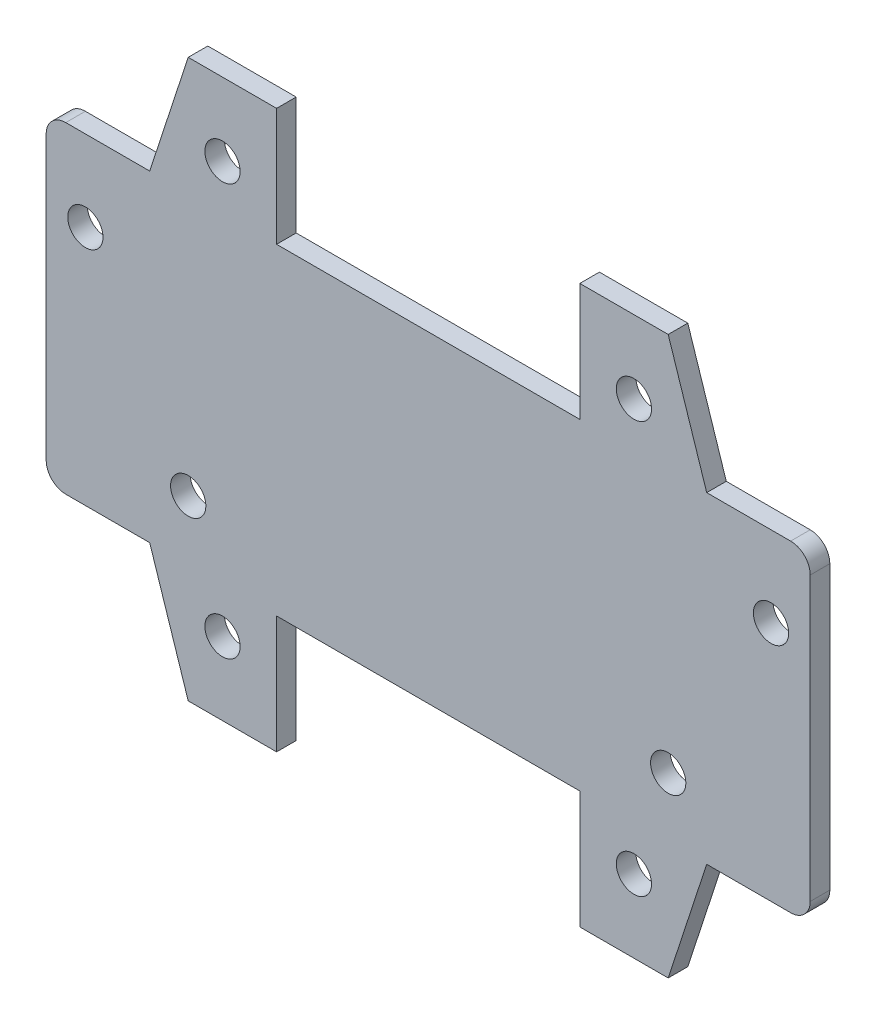
ISO-10303-21;
HEADER;
FILE_DESCRIPTION(('STEP AP214'),'2;1');
FILE_NAME('part.step','',(''),(''),'','','');
FILE_SCHEMA(('AUTOMOTIVE_DESIGN { 1 0 10303 214 1 1 1 1 }'));
ENDSEC;
DATA;
#1=APPLICATION_CONTEXT('core data for automotive mechanical design processes');
#2=APPLICATION_PROTOCOL_DEFINITION('international standard','automotive_design',2000,#1);
#3=PRODUCT_CONTEXT('',#1,'mechanical');
#4=PRODUCT('Part','Part','',(#3));
#5=PRODUCT_RELATED_PRODUCT_CATEGORY('part','',(#4));
#6=PRODUCT_DEFINITION_FORMATION('','',#4);
#7=PRODUCT_DEFINITION_CONTEXT('part definition',#1,'design');
#8=PRODUCT_DEFINITION('design','',#6,#7);
#9=PRODUCT_DEFINITION_SHAPE('','',#8);
#10=(LENGTH_UNIT() NAMED_UNIT(*) SI_UNIT(.MILLI.,.METRE.));
#11=(NAMED_UNIT(*) PLANE_ANGLE_UNIT() SI_UNIT($,.RADIAN.));
#12=(NAMED_UNIT(*) SI_UNIT($,.STERADIAN.) SOLID_ANGLE_UNIT());
#13=UNCERTAINTY_MEASURE_WITH_UNIT(LENGTH_MEASURE(1.E-05),#10,'distance_accuracy_value','');
#14=(GEOMETRIC_REPRESENTATION_CONTEXT(3) GLOBAL_UNCERTAINTY_ASSIGNED_CONTEXT((#13)) GLOBAL_UNIT_ASSIGNED_CONTEXT((#10,
#11,#12)) REPRESENTATION_CONTEXT('',''));
#15=CARTESIAN_POINT('',(0.,0.,0.));
#16=DIRECTION('',(0.,0.,1.));
#17=DIRECTION('',(1.,0.,0.));
#18=AXIS2_PLACEMENT_3D('',#15,#16,#17);
#19=CARTESIAN_POINT('',(0.,-16.4285714285714,2.));
#20=DIRECTION('',(0.,-1.,0.));
#21=DIRECTION('',(0.,0.,-1.));
#22=AXIS2_PLACEMENT_3D('',#19,#20,#21);
#23=PLANE('',#22);
#24=DIRECTION('',(-1.,0.,0.));
#25=VECTOR('',#24,1.);
#26=CARTESIAN_POINT('',(0.,-16.4285714285714,0.));
#27=LINE('',#26,#25);
#28=CARTESIAN_POINT('',(15.4784578863313,-16.4285714285714,0.));
#29=VERTEX_POINT('',#28);
#30=CARTESIAN_POINT('',(-15.4784578863313,-16.4285714285714,0.));
#31=VERTEX_POINT('',#30);
#32=EDGE_CURVE('E203',#29,#31,#27,.T.);
#33=ORIENTED_EDGE('',*,*,#32,.F.);
#34=DIRECTION('',(0.,0.,-1.));
#35=VECTOR('',#34,1.);
#36=CARTESIAN_POINT('',(15.4784578863313,-16.4285714285714,2.));
#37=LINE('',#36,#35);
#38=CARTESIAN_POINT('',(15.4784578863313,-16.4285714285714,2.));
#39=VERTEX_POINT('',#38);
#40=EDGE_CURVE('E199',#39,#29,#37,.T.);
#41=ORIENTED_EDGE('',*,*,#40,.F.);
#42=DIRECTION('',(-1.,0.,0.));
#43=VECTOR('',#42,1.);
#44=CARTESIAN_POINT('',(0.,-16.4285714285714,2.));
#45=LINE('',#44,#43);
#46=CARTESIAN_POINT('',(-15.4784578863313,-16.4285714285714,2.));
#47=VERTEX_POINT('',#46);
#48=EDGE_CURVE('E201',#39,#47,#45,.T.);
#49=ORIENTED_EDGE('',*,*,#48,.T.);
#50=DIRECTION('',(0.,0.,-1.));
#51=VECTOR('',#50,1.);
#52=CARTESIAN_POINT('',(-15.4784578863313,-16.4285714285714,2.));
#53=LINE('',#52,#51);
#54=EDGE_CURVE('E288',#47,#31,#53,.T.);
#55=ORIENTED_EDGE('',*,*,#54,.T.);
#56=EDGE_LOOP('',(#33,#41,#49,#55));
#57=FACE_BOUND('',#56,.T.);
#58=ADVANCED_FACE('F37',(#57),#23,.T.);
#59=CARTESIAN_POINT('',(15.4784578863313,0.,2.));
#60=DIRECTION('',(-1.,0.,0.));
#61=DIRECTION('',(0.,0.,1.));
#62=AXIS2_PLACEMENT_3D('',#59,#60,#61);
#63=PLANE('',#62);
#64=DIRECTION('',(0.,1.,0.));
#65=VECTOR('',#64,1.);
#66=CARTESIAN_POINT('',(15.4784578863313,0.,0.));
#67=LINE('',#66,#65);
#68=CARTESIAN_POINT('',(15.4784578863313,-28.4490152823369,0.));
#69=VERTEX_POINT('',#68);
#70=EDGE_CURVE('E296',#69,#29,#67,.T.);
#71=ORIENTED_EDGE('',*,*,#70,.F.);
#72=DIRECTION('',(0.,0.,-1.));
#73=VECTOR('',#72,1.);
#74=CARTESIAN_POINT('',(15.4784578863313,-28.4490152823369,2.));
#75=LINE('',#74,#73);
#76=CARTESIAN_POINT('',(15.4784578863313,-28.4490152823369,2.));
#77=VERTEX_POINT('',#76);
#78=EDGE_CURVE('E209',#77,#69,#75,.T.);
#79=ORIENTED_EDGE('',*,*,#78,.F.);
#80=DIRECTION('',(0.,1.,0.));
#81=VECTOR('',#80,1.);
#82=CARTESIAN_POINT('',(15.4784578863313,0.,2.));
#83=LINE('',#82,#81);
#84=EDGE_CURVE('E216',#77,#39,#83,.T.);
#85=ORIENTED_EDGE('',*,*,#84,.T.);
#86=ORIENTED_EDGE('',*,*,#40,.T.);
#87=EDGE_LOOP('',(#71,#79,#85,#86));
#88=FACE_BOUND('',#87,.T.);
#89=ADVANCED_FACE('F223',(#88),#63,.T.);
#90=CARTESIAN_POINT('',(0.,-28.4490152823369,2.));
#91=DIRECTION('',(0.,-1.,0.));
#92=DIRECTION('',(1.,0.,0.));
#93=AXIS2_PLACEMENT_3D('',#90,#91,#92);
#94=PLANE('',#93);
#95=DIRECTION('',(-1.,0.,0.));
#96=VECTOR('',#95,1.);
#97=CARTESIAN_POINT('',(0.,-28.4490152823369,0.));
#98=LINE('',#97,#96);
#99=CARTESIAN_POINT('',(24.5,-28.4490152823369,0.));
#100=VERTEX_POINT('',#99);
#101=EDGE_CURVE('E298',#100,#69,#98,.T.);
#102=ORIENTED_EDGE('',*,*,#101,.F.);
#103=DIRECTION('',(0.,0.,-1.));
#104=VECTOR('',#103,1.);
#105=CARTESIAN_POINT('',(24.5,-28.4490152823369,2.));
#106=LINE('',#105,#104);
#107=CARTESIAN_POINT('',(24.5,-28.4490152823369,2.));
#108=VERTEX_POINT('',#107);
#109=EDGE_CURVE('E401',#108,#100,#106,.T.);
#110=ORIENTED_EDGE('',*,*,#109,.F.);
#111=DIRECTION('',(-1.,0.,0.));
#112=VECTOR('',#111,1.);
#113=CARTESIAN_POINT('',(0.,-28.4490152823369,2.));
#114=LINE('',#113,#112);
#115=EDGE_CURVE('E224',#108,#77,#114,.T.);
#116=ORIENTED_EDGE('',*,*,#115,.T.);
#117=ORIENTED_EDGE('',*,*,#78,.T.);
#118=EDGE_LOOP('',(#102,#110,#116,#117));
#119=FACE_BOUND('',#118,.T.);
#120=ADVANCED_FACE('F460',(#119),#94,.T.);
#121=CARTESIAN_POINT('',(30.5374078821787,-9.98542394483885,2.));
#122=DIRECTION('',(0.950476564326026,-0.310796236571476,0.));
#123=DIRECTION('',(0.310796236571476,0.950476564326027,0.));
#124=AXIS2_PLACEMENT_3D('',#121,#122,#123);
#125=PLANE('',#124);
#126=DIRECTION('',(-0.310796236571476,-0.950476564326027,0.));
#127=VECTOR('',#126,1.);
#128=CARTESIAN_POINT('',(30.5374078821787,-9.98542394483885,0.));
#129=LINE('',#128,#127);
#130=CARTESIAN_POINT('',(28.4305637318035,-16.4285714285714,0.));
#131=VERTEX_POINT('',#130);
#132=EDGE_CURVE('E301',#131,#100,#129,.T.);
#133=ORIENTED_EDGE('',*,*,#132,.F.);
#134=DIRECTION('',(0.,0.,-1.));
#135=VECTOR('',#134,1.);
#136=CARTESIAN_POINT('',(28.4305637318035,-16.4285714285714,2.));
#137=LINE('',#136,#135);
#138=CARTESIAN_POINT('',(28.4305637318035,-16.4285714285714,2.));
#139=VERTEX_POINT('',#138);
#140=EDGE_CURVE('E398',#139,#131,#137,.T.);
#141=ORIENTED_EDGE('',*,*,#140,.F.);
#142=DIRECTION('',(-0.310796236571476,-0.950476564326027,0.));
#143=VECTOR('',#142,1.);
#144=CARTESIAN_POINT('',(30.5374078821787,-9.98542394483885,2.));
#145=LINE('',#144,#143);
#146=EDGE_CURVE('E226',#139,#108,#145,.T.);
#147=ORIENTED_EDGE('',*,*,#146,.T.);
#148=ORIENTED_EDGE('',*,*,#109,.T.);
#149=EDGE_LOOP('',(#133,#141,#147,#148));
#150=FACE_BOUND('',#149,.T.);
#151=ADVANCED_FACE('F465',(#150),#125,.T.);
#152=CARTESIAN_POINT('',(0.,-16.4285714285714,2.));
#153=DIRECTION('',(0.,-1.,0.));
#154=DIRECTION('',(1.,0.,0.));
#155=AXIS2_PLACEMENT_3D('',#152,#153,#154);
#156=PLANE('',#155);
#157=DIRECTION('',(-1.,0.,0.));
#158=VECTOR('',#157,1.);
#159=CARTESIAN_POINT('',(0.,-16.4285714285714,0.));
#160=LINE('',#159,#158);
#161=CARTESIAN_POINT('',(37.,-16.4285714285714,0.));
#162=VERTEX_POINT('',#161);
#163=EDGE_CURVE('E304',#162,#131,#160,.T.);
#164=ORIENTED_EDGE('',*,*,#163,.F.);
#165=DIRECTION('',(0.,0.,-1.));
#166=VECTOR('',#165,1.);
#167=CARTESIAN_POINT('',(37.,-16.4285714285714,2.));
#168=LINE('',#167,#166);
#169=CARTESIAN_POINT('',(37.,-16.4285714285714,2.));
#170=VERTEX_POINT('',#169);
#171=EDGE_CURVE('E425',#162,#170,#168,.F.);
#172=ORIENTED_EDGE('',*,*,#171,.T.);
#173=DIRECTION('',(-1.,0.,0.));
#174=VECTOR('',#173,1.);
#175=CARTESIAN_POINT('',(0.,-16.4285714285714,2.));
#176=LINE('',#175,#174);
#177=EDGE_CURVE('E232',#170,#139,#176,.T.);
#178=ORIENTED_EDGE('',*,*,#177,.T.);
#179=ORIENTED_EDGE('',*,*,#140,.T.);
#180=EDGE_LOOP('',(#164,#172,#178,#179));
#181=FACE_BOUND('',#180,.T.);
#182=ADVANCED_FACE('F468',(#181),#156,.T.);
#183=CARTESIAN_POINT('',(39.,0.,2.));
#184=DIRECTION('',(-1.,0.,0.));
#185=DIRECTION('',(0.,0.,1.));
#186=AXIS2_PLACEMENT_3D('',#183,#184,#185);
#187=PLANE('',#186);
#188=DIRECTION('',(0.,1.,0.));
#189=VECTOR('',#188,1.);
#190=CARTESIAN_POINT('',(39.,0.,0.));
#191=LINE('',#190,#189);
#192=CARTESIAN_POINT('',(39.,-14.4285714285714,0.));
#193=VERTEX_POINT('',#192);
#194=CARTESIAN_POINT('',(39.,14.4285714285714,0.));
#195=VERTEX_POINT('',#194);
#196=EDGE_CURVE('E306',#193,#195,#191,.T.);
#197=ORIENTED_EDGE('',*,*,#196,.T.);
#198=DIRECTION('',(0.,0.,-1.));
#199=VECTOR('',#198,1.);
#200=CARTESIAN_POINT('',(39.,14.4285714285714,2.));
#201=LINE('',#200,#199);
#202=CARTESIAN_POINT('',(39.,14.4285714285714,2.));
#203=VERTEX_POINT('',#202);
#204=EDGE_CURVE('E417',#195,#203,#201,.F.);
#205=ORIENTED_EDGE('',*,*,#204,.T.);
#206=DIRECTION('',(0.,1.,0.));
#207=VECTOR('',#206,1.);
#208=CARTESIAN_POINT('',(39.,0.,2.));
#209=LINE('',#208,#207);
#210=CARTESIAN_POINT('',(39.,-14.4285714285714,2.));
#211=VERTEX_POINT('',#210);
#212=EDGE_CURVE('E234',#211,#203,#209,.T.);
#213=ORIENTED_EDGE('',*,*,#212,.F.);
#214=DIRECTION('',(0.,0.,-1.));
#215=VECTOR('',#214,1.);
#216=CARTESIAN_POINT('',(39.,-14.4285714285714,0.));
#217=LINE('',#216,#215);
#218=EDGE_CURVE('E414',#211,#193,#217,.T.);
#219=ORIENTED_EDGE('',*,*,#218,.T.);
#220=EDGE_LOOP('',(#197,#205,#213,#219));
#221=FACE_BOUND('',#220,.T.);
#222=ADVANCED_FACE('F477',(#221),#187,.F.);
#223=CARTESIAN_POINT('',(0.,16.4285714285714,2.));
#224=DIRECTION('',(0.,-1.,0.));
#225=DIRECTION('',(1.,0.,0.));
#226=AXIS2_PLACEMENT_3D('',#223,#224,#225);
#227=PLANE('',#226);
#228=DIRECTION('',(-1.,0.,0.));
#229=VECTOR('',#228,1.);
#230=CARTESIAN_POINT('',(0.,16.4285714285714,2.));
#231=LINE('',#230,#229);
#232=CARTESIAN_POINT('',(37.,16.4285714285714,2.));
#233=VERTEX_POINT('',#232);
#234=CARTESIAN_POINT('',(28.4305637318035,16.4285714285714,2.));
#235=VERTEX_POINT('',#234);
#236=EDGE_CURVE('E236',#233,#235,#231,.T.);
#237=ORIENTED_EDGE('',*,*,#236,.F.);
#238=DIRECTION('',(0.,0.,-1.));
#239=VECTOR('',#238,1.);
#240=CARTESIAN_POINT('',(37.,16.4285714285714,2.));
#241=LINE('',#240,#239);
#242=CARTESIAN_POINT('',(37.,16.4285714285714,0.));
#243=VERTEX_POINT('',#242);
#244=EDGE_CURVE('E208',#233,#243,#241,.T.);
#245=ORIENTED_EDGE('',*,*,#244,.T.);
#246=DIRECTION('',(-1.,0.,0.));
#247=VECTOR('',#246,1.);
#248=CARTESIAN_POINT('',(0.,16.4285714285714,0.));
#249=LINE('',#248,#247);
#250=CARTESIAN_POINT('',(28.4305637318035,16.4285714285714,0.));
#251=VERTEX_POINT('',#250);
#252=EDGE_CURVE('E309',#243,#251,#249,.T.);
#253=ORIENTED_EDGE('',*,*,#252,.T.);
#254=DIRECTION('',(0.,0.,-1.));
#255=VECTOR('',#254,1.);
#256=CARTESIAN_POINT('',(28.4305637318035,16.4285714285714,2.));
#257=LINE('',#256,#255);
#258=EDGE_CURVE('E395',#235,#251,#257,.T.);
#259=ORIENTED_EDGE('',*,*,#258,.F.);
#260=EDGE_LOOP('',(#237,#245,#253,#259));
#261=FACE_BOUND('',#260,.T.);
#262=ADVANCED_FACE('F486',(#261),#227,.F.);
#263=CARTESIAN_POINT('',(30.5374078821787,9.98542394483887,2.));
#264=DIRECTION('',(-0.950476564326026,-0.310796236571476,0.));
#265=DIRECTION('',(0.310796236571476,-0.950476564326026,0.));
#266=AXIS2_PLACEMENT_3D('',#263,#264,#265);
#267=PLANE('',#266);
#268=DIRECTION('',(-0.310796236571476,0.950476564326026,0.));
#269=VECTOR('',#268,1.);
#270=CARTESIAN_POINT('',(30.5374078821787,9.98542394483887,0.));
#271=LINE('',#270,#269);
#272=CARTESIAN_POINT('',(24.5,28.4490152823369,0.));
#273=VERTEX_POINT('',#272);
#274=EDGE_CURVE('E311',#251,#273,#271,.T.);
#275=ORIENTED_EDGE('',*,*,#274,.T.);
#276=DIRECTION('',(0.,0.,-1.));
#277=VECTOR('',#276,1.);
#278=CARTESIAN_POINT('',(24.5,28.4490152823369,2.));
#279=LINE('',#278,#277);
#280=CARTESIAN_POINT('',(24.5,28.4490152823369,2.));
#281=VERTEX_POINT('',#280);
#282=EDGE_CURVE('E392',#281,#273,#279,.T.);
#283=ORIENTED_EDGE('',*,*,#282,.F.);
#284=DIRECTION('',(-0.310796236571476,0.950476564326026,0.));
#285=VECTOR('',#284,1.);
#286=CARTESIAN_POINT('',(30.5374078821787,9.98542394483887,2.));
#287=LINE('',#286,#285);
#288=EDGE_CURVE('E238',#235,#281,#287,.T.);
#289=ORIENTED_EDGE('',*,*,#288,.F.);
#290=ORIENTED_EDGE('',*,*,#258,.T.);
#291=EDGE_LOOP('',(#275,#283,#289,#290));
#292=FACE_BOUND('',#291,.T.);
#293=ADVANCED_FACE('F491',(#292),#267,.F.);
#294=CARTESIAN_POINT('',(0.,28.4490152823369,2.));
#295=DIRECTION('',(0.,-1.,0.));
#296=DIRECTION('',(0.,0.,-1.));
#297=AXIS2_PLACEMENT_3D('',#294,#295,#296);
#298=PLANE('',#297);
#299=DIRECTION('',(-1.,0.,0.));
#300=VECTOR('',#299,1.);
#301=CARTESIAN_POINT('',(0.,28.4490152823369,0.));
#302=LINE('',#301,#300);
#303=CARTESIAN_POINT('',(15.4784578863313,28.4490152823369,0.));
#304=VERTEX_POINT('',#303);
#305=EDGE_CURVE('E314',#273,#304,#302,.T.);
#306=ORIENTED_EDGE('',*,*,#305,.T.);
#307=DIRECTION('',(0.,0.,-1.));
#308=VECTOR('',#307,1.);
#309=CARTESIAN_POINT('',(15.4784578863313,28.4490152823369,2.));
#310=LINE('',#309,#308);
#311=CARTESIAN_POINT('',(15.4784578863313,28.4490152823369,2.));
#312=VERTEX_POINT('',#311);
#313=EDGE_CURVE('E389',#312,#304,#310,.T.);
#314=ORIENTED_EDGE('',*,*,#313,.F.);
#315=DIRECTION('',(-1.,0.,0.));
#316=VECTOR('',#315,1.);
#317=CARTESIAN_POINT('',(0.,28.4490152823369,2.));
#318=LINE('',#317,#316);
#319=EDGE_CURVE('E241',#281,#312,#318,.T.);
#320=ORIENTED_EDGE('',*,*,#319,.F.);
#321=ORIENTED_EDGE('',*,*,#282,.T.);
#322=EDGE_LOOP('',(#306,#314,#320,#321));
#323=FACE_BOUND('',#322,.T.);
#324=ADVANCED_FACE('F493',(#323),#298,.F.);
#325=CARTESIAN_POINT('',(15.4784578863313,0.,2.));
#326=DIRECTION('',(1.,0.,0.));
#327=DIRECTION('',(0.,0.,-1.));
#328=AXIS2_PLACEMENT_3D('',#325,#326,#327);
#329=PLANE('',#328);
#330=DIRECTION('',(0.,-1.,0.));
#331=VECTOR('',#330,1.);
#332=CARTESIAN_POINT('',(15.4784578863313,0.,0.));
#333=LINE('',#332,#331);
#334=CARTESIAN_POINT('',(15.4784578863313,16.4285714285714,0.));
#335=VERTEX_POINT('',#334);
#336=EDGE_CURVE('E317',#304,#335,#333,.T.);
#337=ORIENTED_EDGE('',*,*,#336,.T.);
#338=DIRECTION('',(0.,0.,-1.));
#339=VECTOR('',#338,1.);
#340=CARTESIAN_POINT('',(15.4784578863313,16.4285714285714,2.));
#341=LINE('',#340,#339);
#342=CARTESIAN_POINT('',(15.4784578863313,16.4285714285714,2.));
#343=VERTEX_POINT('',#342);
#344=EDGE_CURVE('E386',#343,#335,#341,.T.);
#345=ORIENTED_EDGE('',*,*,#344,.F.);
#346=DIRECTION('',(0.,-1.,0.));
#347=VECTOR('',#346,1.);
#348=CARTESIAN_POINT('',(15.4784578863313,0.,2.));
#349=LINE('',#348,#347);
#350=EDGE_CURVE('E244',#312,#343,#349,.T.);
#351=ORIENTED_EDGE('',*,*,#350,.F.);
#352=ORIENTED_EDGE('',*,*,#313,.T.);
#353=EDGE_LOOP('',(#337,#345,#351,#352));
#354=FACE_BOUND('',#353,.T.);
#355=ADVANCED_FACE('F499',(#354),#329,.F.);
#356=CARTESIAN_POINT('',(0.,16.4285714285714,2.));
#357=DIRECTION('',(0.,-1.,0.));
#358=DIRECTION('',(0.,0.,-1.));
#359=AXIS2_PLACEMENT_3D('',#356,#357,#358);
#360=PLANE('',#359);
#361=DIRECTION('',(-1.,0.,0.));
#362=VECTOR('',#361,1.);
#363=CARTESIAN_POINT('',(0.,16.4285714285714,0.));
#364=LINE('',#363,#362);
#365=CARTESIAN_POINT('',(-15.4784578863313,16.4285714285714,0.));
#366=VERTEX_POINT('',#365);
#367=EDGE_CURVE('E320',#335,#366,#364,.T.);
#368=ORIENTED_EDGE('',*,*,#367,.T.);
#369=DIRECTION('',(0.,0.,-1.));
#370=VECTOR('',#369,1.);
#371=CARTESIAN_POINT('',(-15.4784578863313,16.4285714285714,2.));
#372=LINE('',#371,#370);
#373=CARTESIAN_POINT('',(-15.4784578863313,16.4285714285714,2.));
#374=VERTEX_POINT('',#373);
#375=EDGE_CURVE('E384',#374,#366,#372,.T.);
#376=ORIENTED_EDGE('',*,*,#375,.F.);
#377=DIRECTION('',(-1.,0.,0.));
#378=VECTOR('',#377,1.);
#379=CARTESIAN_POINT('',(0.,16.4285714285714,2.));
#380=LINE('',#379,#378);
#381=EDGE_CURVE('E247',#343,#374,#380,.T.);
#382=ORIENTED_EDGE('',*,*,#381,.F.);
#383=ORIENTED_EDGE('',*,*,#344,.T.);
#384=EDGE_LOOP('',(#368,#376,#382,#383));
#385=FACE_BOUND('',#384,.T.);
#386=ADVANCED_FACE('F501',(#385),#360,.F.);
#387=CARTESIAN_POINT('',(-15.4784578863313,0.,2.));
#388=DIRECTION('',(1.,0.,0.));
#389=DIRECTION('',(0.,0.,-1.));
#390=AXIS2_PLACEMENT_3D('',#387,#388,#389);
#391=PLANE('',#390);
#392=DIRECTION('',(0.,-1.,0.));
#393=VECTOR('',#392,1.);
#394=CARTESIAN_POINT('',(-15.4784578863313,0.,0.));
#395=LINE('',#394,#393);
#396=CARTESIAN_POINT('',(-15.4784578863313,28.4490152823369,0.));
#397=VERTEX_POINT('',#396);
#398=EDGE_CURVE('E323',#397,#366,#395,.T.);
#399=ORIENTED_EDGE('',*,*,#398,.F.);
#400=DIRECTION('',(0.,0.,-1.));
#401=VECTOR('',#400,1.);
#402=CARTESIAN_POINT('',(-15.4784578863313,28.4490152823369,2.));
#403=LINE('',#402,#401);
#404=CARTESIAN_POINT('',(-15.4784578863313,28.4490152823369,2.));
#405=VERTEX_POINT('',#404);
#406=EDGE_CURVE('E382',#405,#397,#403,.T.);
#407=ORIENTED_EDGE('',*,*,#406,.F.);
#408=DIRECTION('',(0.,-1.,0.));
#409=VECTOR('',#408,1.);
#410=CARTESIAN_POINT('',(-15.4784578863313,0.,2.));
#411=LINE('',#410,#409);
#412=EDGE_CURVE('E249',#405,#374,#411,.T.);
#413=ORIENTED_EDGE('',*,*,#412,.T.);
#414=ORIENTED_EDGE('',*,*,#375,.T.);
#415=EDGE_LOOP('',(#399,#407,#413,#414));
#416=FACE_BOUND('',#415,.T.);
#417=ADVANCED_FACE('F504',(#416),#391,.T.);
#418=CARTESIAN_POINT('',(0.,28.4490152823369,2.));
#419=DIRECTION('',(0.,1.,0.));
#420=DIRECTION('',(0.,0.,1.));
#421=AXIS2_PLACEMENT_3D('',#418,#419,#420);
#422=PLANE('',#421);
#423=DIRECTION('',(1.,0.,0.));
#424=VECTOR('',#423,1.);
#425=CARTESIAN_POINT('',(0.,28.4490152823369,0.));
#426=LINE('',#425,#424);
#427=CARTESIAN_POINT('',(-24.5,28.4490152823369,0.));
#428=VERTEX_POINT('',#427);
#429=EDGE_CURVE('E326',#428,#397,#426,.T.);
#430=ORIENTED_EDGE('',*,*,#429,.F.);
#431=DIRECTION('',(0.,0.,-1.));
#432=VECTOR('',#431,1.);
#433=CARTESIAN_POINT('',(-24.5,28.4490152823369,2.));
#434=LINE('',#433,#432);
#435=CARTESIAN_POINT('',(-24.5,28.4490152823369,2.));
#436=VERTEX_POINT('',#435);
#437=EDGE_CURVE('E380',#436,#428,#434,.T.);
#438=ORIENTED_EDGE('',*,*,#437,.F.);
#439=DIRECTION('',(1.,0.,0.));
#440=VECTOR('',#439,1.);
#441=CARTESIAN_POINT('',(0.,28.4490152823369,2.));
#442=LINE('',#441,#440);
#443=EDGE_CURVE('E252',#436,#405,#442,.T.);
#444=ORIENTED_EDGE('',*,*,#443,.T.);
#445=ORIENTED_EDGE('',*,*,#406,.T.);
#446=EDGE_LOOP('',(#430,#438,#444,#445));
#447=FACE_BOUND('',#446,.T.);
#448=ADVANCED_FACE('F509',(#447),#422,.T.);
#449=CARTESIAN_POINT('',(-30.5374078821787,9.98542394483887,2.));
#450=DIRECTION('',(-0.950476564326026,0.310796236571476,0.));
#451=DIRECTION('',(-0.310796236571476,-0.950476564326026,0.));
#452=AXIS2_PLACEMENT_3D('',#449,#450,#451);
#453=PLANE('',#452);
#454=DIRECTION('',(0.310796236571476,0.950476564326026,0.));
#455=VECTOR('',#454,1.);
#456=CARTESIAN_POINT('',(-30.5374078821787,9.98542394483887,0.));
#457=LINE('',#456,#455);
#458=CARTESIAN_POINT('',(-28.4305637318035,16.4285714285714,0.));
#459=VERTEX_POINT('',#458);
#460=EDGE_CURVE('E329',#459,#428,#457,.T.);
#461=ORIENTED_EDGE('',*,*,#460,.F.);
#462=DIRECTION('',(0.,0.,-1.));
#463=VECTOR('',#462,1.);
#464=CARTESIAN_POINT('',(-28.4305637318035,16.4285714285714,2.));
#465=LINE('',#464,#463);
#466=CARTESIAN_POINT('',(-28.4305637318035,16.4285714285714,2.));
#467=VERTEX_POINT('',#466);
#468=EDGE_CURVE('E378',#467,#459,#465,.T.);
#469=ORIENTED_EDGE('',*,*,#468,.F.);
#470=DIRECTION('',(0.310796236571476,0.950476564326026,0.));
#471=VECTOR('',#470,1.);
#472=CARTESIAN_POINT('',(-30.5374078821787,9.98542394483887,2.));
#473=LINE('',#472,#471);
#474=EDGE_CURVE('E255',#467,#436,#473,.T.);
#475=ORIENTED_EDGE('',*,*,#474,.T.);
#476=ORIENTED_EDGE('',*,*,#437,.T.);
#477=EDGE_LOOP('',(#461,#469,#475,#476));
#478=FACE_BOUND('',#477,.T.);
#479=ADVANCED_FACE('F512',(#478),#453,.T.);
#480=CARTESIAN_POINT('',(0.,16.4285714285714,2.));
#481=DIRECTION('',(0.,-1.,0.));
#482=DIRECTION('',(0.,0.,-1.));
#483=AXIS2_PLACEMENT_3D('',#480,#481,#482);
#484=PLANE('',#483);
#485=DIRECTION('',(-1.,0.,0.));
#486=VECTOR('',#485,1.);
#487=CARTESIAN_POINT('',(0.,16.4285714285714,0.));
#488=LINE('',#487,#486);
#489=CARTESIAN_POINT('',(-37.,16.4285714285714,0.));
#490=VERTEX_POINT('',#489);
#491=EDGE_CURVE('E332',#459,#490,#488,.T.);
#492=ORIENTED_EDGE('',*,*,#491,.T.);
#493=DIRECTION('',(0.,0.,-1.));
#494=VECTOR('',#493,1.);
#495=CARTESIAN_POINT('',(-37.,16.4285714285714,2.));
#496=LINE('',#495,#494);
#497=CARTESIAN_POINT('',(-37.,16.4285714285714,2.));
#498=VERTEX_POINT('',#497);
#499=EDGE_CURVE('E11',#490,#498,#496,.F.);
#500=ORIENTED_EDGE('',*,*,#499,.T.);
#501=DIRECTION('',(-1.,0.,0.));
#502=VECTOR('',#501,1.);
#503=CARTESIAN_POINT('',(0.,16.4285714285714,2.));
#504=LINE('',#503,#502);
#505=EDGE_CURVE('E258',#467,#498,#504,.T.);
#506=ORIENTED_EDGE('',*,*,#505,.F.);
#507=ORIENTED_EDGE('',*,*,#468,.T.);
#508=EDGE_LOOP('',(#492,#500,#506,#507));
#509=FACE_BOUND('',#508,.T.);
#510=ADVANCED_FACE('F518',(#509),#484,.F.);
#511=CARTESIAN_POINT('',(-39.,0.,2.));
#512=DIRECTION('',(-1.,0.,0.));
#513=DIRECTION('',(0.,0.,1.));
#514=AXIS2_PLACEMENT_3D('',#511,#512,#513);
#515=PLANE('',#514);
#516=DIRECTION('',(0.,1.,0.));
#517=VECTOR('',#516,1.);
#518=CARTESIAN_POINT('',(-39.,0.,0.));
#519=LINE('',#518,#517);
#520=CARTESIAN_POINT('',(-39.,-14.4285714285714,0.));
#521=VERTEX_POINT('',#520);
#522=CARTESIAN_POINT('',(-39.,14.4285714285714,0.));
#523=VERTEX_POINT('',#522);
#524=EDGE_CURVE('E335',#521,#523,#519,.T.);
#525=ORIENTED_EDGE('',*,*,#524,.F.);
#526=DIRECTION('',(0.,0.,-1.));
#527=VECTOR('',#526,1.);
#528=CARTESIAN_POINT('',(-39.,-14.4285714285714,2.));
#529=LINE('',#528,#527);
#530=CARTESIAN_POINT('',(-39.,-14.4285714285714,2.));
#531=VERTEX_POINT('',#530);
#532=EDGE_CURVE('E45',#521,#531,#529,.F.);
#533=ORIENTED_EDGE('',*,*,#532,.T.);
#534=DIRECTION('',(0.,1.,0.));
#535=VECTOR('',#534,1.);
#536=CARTESIAN_POINT('',(-39.,0.,2.));
#537=LINE('',#536,#535);
#538=CARTESIAN_POINT('',(-39.,14.4285714285714,2.));
#539=VERTEX_POINT('',#538);
#540=EDGE_CURVE('E260',#531,#539,#537,.T.);
#541=ORIENTED_EDGE('',*,*,#540,.T.);
#542=DIRECTION('',(0.,0.,-1.));
#543=VECTOR('',#542,1.);
#544=CARTESIAN_POINT('',(-39.,14.4285714285714,0.));
#545=LINE('',#544,#543);
#546=EDGE_CURVE('E430',#539,#523,#545,.T.);
#547=ORIENTED_EDGE('',*,*,#546,.T.);
#548=EDGE_LOOP('',(#525,#533,#541,#547));
#549=FACE_BOUND('',#548,.T.);
#550=ADVANCED_FACE('F435',(#549),#515,.T.);
#551=CARTESIAN_POINT('',(0.,-16.4285714285714,2.));
#552=DIRECTION('',(0.,-1.,0.));
#553=DIRECTION('',(0.,0.,-1.));
#554=AXIS2_PLACEMENT_3D('',#551,#552,#553);
#555=PLANE('',#554);
#556=DIRECTION('',(-1.,0.,0.));
#557=VECTOR('',#556,1.);
#558=CARTESIAN_POINT('',(0.,-16.4285714285714,2.));
#559=LINE('',#558,#557);
#560=CARTESIAN_POINT('',(-28.4305637318035,-16.4285714285714,2.));
#561=VERTEX_POINT('',#560);
#562=CARTESIAN_POINT('',(-37.,-16.4285714285714,2.));
#563=VERTEX_POINT('',#562);
#564=EDGE_CURVE('E262',#561,#563,#559,.T.);
#565=ORIENTED_EDGE('',*,*,#564,.T.);
#566=DIRECTION('',(0.,0.,-1.));
#567=VECTOR('',#566,1.);
#568=CARTESIAN_POINT('',(-37.,-16.4285714285714,2.));
#569=LINE('',#568,#567);
#570=CARTESIAN_POINT('',(-37.,-16.4285714285714,0.));
#571=VERTEX_POINT('',#570);
#572=EDGE_CURVE('E427',#563,#571,#569,.T.);
#573=ORIENTED_EDGE('',*,*,#572,.T.);
#574=DIRECTION('',(-1.,0.,0.));
#575=VECTOR('',#574,1.);
#576=CARTESIAN_POINT('',(0.,-16.4285714285714,0.));
#577=LINE('',#576,#575);
#578=CARTESIAN_POINT('',(-28.4305637318035,-16.4285714285714,0.));
#579=VERTEX_POINT('',#578);
#580=EDGE_CURVE('E338',#579,#571,#577,.T.);
#581=ORIENTED_EDGE('',*,*,#580,.F.);
#582=DIRECTION('',(0.,0.,-1.));
#583=VECTOR('',#582,1.);
#584=CARTESIAN_POINT('',(-28.4305637318035,-16.4285714285714,2.));
#585=LINE('',#584,#583);
#586=EDGE_CURVE('E376',#561,#579,#585,.T.);
#587=ORIENTED_EDGE('',*,*,#586,.F.);
#588=EDGE_LOOP('',(#565,#573,#581,#587));
#589=FACE_BOUND('',#588,.T.);
#590=ADVANCED_FACE('F442',(#589),#555,.T.);
#591=CARTESIAN_POINT('',(-30.5374078821787,-9.98542394483889,2.));
#592=DIRECTION('',(0.950476564326026,0.310796236571477,0.));
#593=DIRECTION('',(-0.310796236571477,0.950476564326026,0.));
#594=AXIS2_PLACEMENT_3D('',#591,#592,#593);
#595=PLANE('',#594);
#596=DIRECTION('',(0.310796236571477,-0.950476564326026,0.));
#597=VECTOR('',#596,1.);
#598=CARTESIAN_POINT('',(-30.5374078821787,-9.98542394483889,0.));
#599=LINE('',#598,#597);
#600=CARTESIAN_POINT('',(-24.5,-28.4490152823369,0.));
#601=VERTEX_POINT('',#600);
#602=EDGE_CURVE('E341',#579,#601,#599,.T.);
#603=ORIENTED_EDGE('',*,*,#602,.T.);
#604=DIRECTION('',(0.,0.,-1.));
#605=VECTOR('',#604,1.);
#606=CARTESIAN_POINT('',(-24.5,-28.4490152823369,2.));
#607=LINE('',#606,#605);
#608=CARTESIAN_POINT('',(-24.5,-28.4490152823369,2.));
#609=VERTEX_POINT('',#608);
#610=EDGE_CURVE('E373',#609,#601,#607,.T.);
#611=ORIENTED_EDGE('',*,*,#610,.F.);
#612=DIRECTION('',(0.310796236571477,-0.950476564326026,0.));
#613=VECTOR('',#612,1.);
#614=CARTESIAN_POINT('',(-30.5374078821787,-9.98542394483889,2.));
#615=LINE('',#614,#613);
#616=EDGE_CURVE('E264',#561,#609,#615,.T.);
#617=ORIENTED_EDGE('',*,*,#616,.F.);
#618=ORIENTED_EDGE('',*,*,#586,.T.);
#619=EDGE_LOOP('',(#603,#611,#617,#618));
#620=FACE_BOUND('',#619,.T.);
#621=ADVANCED_FACE('F450',(#620),#595,.F.);
#622=CARTESIAN_POINT('',(0.,-28.4490152823369,2.));
#623=DIRECTION('',(0.,1.,0.));
#624=DIRECTION('',(-1.,0.,0.));
#625=AXIS2_PLACEMENT_3D('',#622,#623,#624);
#626=PLANE('',#625);
#627=DIRECTION('',(1.,0.,0.));
#628=VECTOR('',#627,1.);
#629=CARTESIAN_POINT('',(0.,-28.4490152823369,0.));
#630=LINE('',#629,#628);
#631=CARTESIAN_POINT('',(-15.4784578863313,-28.4490152823369,0.));
#632=VERTEX_POINT('',#631);
#633=EDGE_CURVE('E344',#601,#632,#630,.T.);
#634=ORIENTED_EDGE('',*,*,#633,.T.);
#635=DIRECTION('',(0.,0.,-1.));
#636=VECTOR('',#635,1.);
#637=CARTESIAN_POINT('',(-15.4784578863313,-28.4490152823369,2.));
#638=LINE('',#637,#636);
#639=CARTESIAN_POINT('',(-15.4784578863313,-28.4490152823369,2.));
#640=VERTEX_POINT('',#639);
#641=EDGE_CURVE('E370',#640,#632,#638,.T.);
#642=ORIENTED_EDGE('',*,*,#641,.F.);
#643=DIRECTION('',(1.,0.,0.));
#644=VECTOR('',#643,1.);
#645=CARTESIAN_POINT('',(0.,-28.4490152823369,2.));
#646=LINE('',#645,#644);
#647=EDGE_CURVE('E267',#609,#640,#646,.T.);
#648=ORIENTED_EDGE('',*,*,#647,.F.);
#649=ORIENTED_EDGE('',*,*,#610,.T.);
#650=EDGE_LOOP('',(#634,#642,#648,#649));
#651=FACE_BOUND('',#650,.T.);
#652=ADVANCED_FACE('F454',(#651),#626,.F.);
#653=CARTESIAN_POINT('',(-21.,-21.,2.));
#654=DIRECTION('',(0.,0.,-1.));
#655=DIRECTION('',(-1.,0.,0.));
#656=AXIS2_PLACEMENT_3D('',#653,#654,#655);
#657=CYLINDRICAL_SURFACE('',#656,1.80000000000002);
#658=CARTESIAN_POINT('',(-21.,-21.,2.));
#659=DIRECTION('',(0.,0.,1.));
#660=DIRECTION('',(1.,0.,0.));
#661=AXIS2_PLACEMENT_3D('',#658,#659,#660);
#662=CIRCLE('',#661,1.80000000000002);
#663=CARTESIAN_POINT('',(-19.2,-21.,2.));
#664=VERTEX_POINT('',#663);
#665=EDGE_CURVE('E282',#664,#664,#662,.T.);
#666=ORIENTED_EDGE('',*,*,#665,.T.);
#667=EDGE_LOOP('',(#666));
#668=FACE_BOUND('',#667,.T.);
#669=CARTESIAN_POINT('',(-21.,-21.,0.));
#670=DIRECTION('',(0.,0.,1.));
#671=DIRECTION('',(1.,0.,0.));
#672=AXIS2_PLACEMENT_3D('',#669,#670,#671);
#673=CIRCLE('',#672,1.80000000000002);
#674=CARTESIAN_POINT('',(-19.2,-21.,0.));
#675=VERTEX_POINT('',#674);
#676=EDGE_CURVE('E362',#675,#675,#673,.T.);
#677=ORIENTED_EDGE('',*,*,#676,.F.);
#678=EDGE_LOOP('',(#677));
#679=FACE_BOUND('',#678,.T.);
#680=ADVANCED_FACE('F705',(#668,#679),#657,.F.);
#681=CARTESIAN_POINT('',(-35.,8.17948717948715,2.));
#682=DIRECTION('',(0.,0.,-1.));
#683=DIRECTION('',(-1.,0.,0.));
#684=AXIS2_PLACEMENT_3D('',#681,#682,#683);
#685=CYLINDRICAL_SURFACE('',#684,1.8);
#686=CARTESIAN_POINT('',(-35.,8.17948717948715,2.));
#687=DIRECTION('',(0.,0.,1.));
#688=DIRECTION('',(1.,0.,0.));
#689=AXIS2_PLACEMENT_3D('',#686,#687,#688);
#690=CIRCLE('',#689,1.8);
#691=CARTESIAN_POINT('',(-33.2,8.17948717948715,2.));
#692=VERTEX_POINT('',#691);
#693=EDGE_CURVE('E279',#692,#692,#690,.F.);
#694=ORIENTED_EDGE('',*,*,#693,.F.);
#695=EDGE_LOOP('',(#694));
#696=FACE_BOUND('',#695,.T.);
#697=CARTESIAN_POINT('',(-35.,8.17948717948715,0.));
#698=DIRECTION('',(0.,0.,1.));
#699=DIRECTION('',(1.,0.,0.));
#700=AXIS2_PLACEMENT_3D('',#697,#698,#699);
#701=CIRCLE('',#700,1.8);
#702=CARTESIAN_POINT('',(-33.2,8.17948717948715,0.));
#703=VERTEX_POINT('',#702);
#704=EDGE_CURVE('E359',#703,#703,#701,.F.);
#705=ORIENTED_EDGE('',*,*,#704,.T.);
#706=EDGE_LOOP('',(#705));
#707=FACE_BOUND('',#706,.T.);
#708=ADVANCED_FACE('F695',(#696,#707),#685,.F.);
#709=CARTESIAN_POINT('',(35.,8.17948717948715,2.));
#710=DIRECTION('',(0.,0.,-1.));
#711=DIRECTION('',(-1.,0.,0.));
#712=AXIS2_PLACEMENT_3D('',#709,#710,#711);
#713=CYLINDRICAL_SURFACE('',#712,1.8);
#714=CARTESIAN_POINT('',(35.,8.17948717948715,2.));
#715=DIRECTION('',(0.,0.,1.));
#716=DIRECTION('',(1.,0.,0.));
#717=AXIS2_PLACEMENT_3D('',#714,#715,#716);
#718=CIRCLE('',#717,1.8);
#719=CARTESIAN_POINT('',(36.8,8.17948717948715,2.));
#720=VERTEX_POINT('',#719);
#721=EDGE_CURVE('E276',#720,#720,#718,.T.);
#722=ORIENTED_EDGE('',*,*,#721,.T.);
#723=EDGE_LOOP('',(#722));
#724=FACE_BOUND('',#723,.T.);
#725=CARTESIAN_POINT('',(35.,8.17948717948715,0.));
#726=DIRECTION('',(0.,0.,1.));
#727=DIRECTION('',(1.,0.,0.));
#728=AXIS2_PLACEMENT_3D('',#725,#726,#727);
#729=CIRCLE('',#728,1.8);
#730=CARTESIAN_POINT('',(36.8,8.17948717948715,0.));
#731=VERTEX_POINT('',#730);
#732=EDGE_CURVE('E356',#731,#731,#729,.T.);
#733=ORIENTED_EDGE('',*,*,#732,.F.);
#734=EDGE_LOOP('',(#733));
#735=FACE_BOUND('',#734,.T.);
#736=ADVANCED_FACE('F685',(#724,#735),#713,.F.);
#737=CARTESIAN_POINT('',(-24.5,-10.3205128205128,2.));
#738=DIRECTION('',(0.,0.,-1.));
#739=DIRECTION('',(-1.,0.,0.));
#740=AXIS2_PLACEMENT_3D('',#737,#738,#739);
#741=CYLINDRICAL_SURFACE('',#740,1.8);
#742=CARTESIAN_POINT('',(-24.5,-10.3205128205128,2.));
#743=DIRECTION('',(0.,0.,1.));
#744=DIRECTION('',(1.,0.,0.));
#745=AXIS2_PLACEMENT_3D('',#742,#743,#744);
#746=CIRCLE('',#745,1.8);
#747=CARTESIAN_POINT('',(-22.7,-10.3205128205128,2.));
#748=VERTEX_POINT('',#747);
#749=EDGE_CURVE('E273',#748,#748,#746,.T.);
#750=ORIENTED_EDGE('',*,*,#749,.T.);
#751=EDGE_LOOP('',(#750));
#752=FACE_BOUND('',#751,.T.);
#753=CARTESIAN_POINT('',(-24.5,-10.3205128205128,0.));
#754=DIRECTION('',(0.,0.,1.));
#755=DIRECTION('',(1.,0.,0.));
#756=AXIS2_PLACEMENT_3D('',#753,#754,#755);
#757=CIRCLE('',#756,1.8);
#758=CARTESIAN_POINT('',(-22.7,-10.3205128205128,0.));
#759=VERTEX_POINT('',#758);
#760=EDGE_CURVE('E353',#759,#759,#757,.T.);
#761=ORIENTED_EDGE('',*,*,#760,.F.);
#762=EDGE_LOOP('',(#761));
#763=FACE_BOUND('',#762,.T.);
#764=ADVANCED_FACE('F675',(#752,#763),#741,.F.);
#765=CARTESIAN_POINT('',(24.5,-10.3205128205128,2.));
#766=DIRECTION('',(0.,0.,-1.));
#767=DIRECTION('',(-1.,0.,0.));
#768=AXIS2_PLACEMENT_3D('',#765,#766,#767);
#769=CYLINDRICAL_SURFACE('',#768,1.8);
#770=CARTESIAN_POINT('',(24.5,-10.3205128205128,2.));
#771=DIRECTION('',(0.,0.,1.));
#772=DIRECTION('',(1.,0.,0.));
#773=AXIS2_PLACEMENT_3D('',#770,#771,#772);
#774=CIRCLE('',#773,1.8);
#775=CARTESIAN_POINT('',(26.3,-10.3205128205128,2.));
#776=VERTEX_POINT('',#775);
#777=EDGE_CURVE('E270',#776,#776,#774,.T.);
#778=ORIENTED_EDGE('',*,*,#777,.T.);
#779=EDGE_LOOP('',(#778));
#780=FACE_BOUND('',#779,.T.);
#781=CARTESIAN_POINT('',(24.5,-10.3205128205128,0.));
#782=DIRECTION('',(0.,0.,1.));
#783=DIRECTION('',(1.,0.,0.));
#784=AXIS2_PLACEMENT_3D('',#781,#782,#783);
#785=CIRCLE('',#784,1.8);
#786=CARTESIAN_POINT('',(26.3,-10.3205128205128,0.));
#787=VERTEX_POINT('',#786);
#788=EDGE_CURVE('E350',#787,#787,#785,.T.);
#789=ORIENTED_EDGE('',*,*,#788,.F.);
#790=EDGE_LOOP('',(#789));
#791=FACE_BOUND('',#790,.T.);
#792=ADVANCED_FACE('F666',(#780,#791),#769,.F.);
#793=CARTESIAN_POINT('',(-15.4784578863313,0.,2.));
#794=DIRECTION('',(-1.,0.,0.));
#795=DIRECTION('',(0.,0.,1.));
#796=AXIS2_PLACEMENT_3D('',#793,#794,#795);
#797=PLANE('',#796);
#798=DIRECTION('',(0.,1.,0.));
#799=VECTOR('',#798,1.);
#800=CARTESIAN_POINT('',(-15.4784578863313,0.,0.));
#801=LINE('',#800,#799);
#802=EDGE_CURVE('E347',#632,#31,#801,.T.);
#803=ORIENTED_EDGE('',*,*,#802,.T.);
#804=ORIENTED_EDGE('',*,*,#54,.F.);
#805=DIRECTION('',(0.,1.,0.));
#806=VECTOR('',#805,1.);
#807=CARTESIAN_POINT('',(-15.4784578863313,0.,2.));
#808=LINE('',#807,#806);
#809=EDGE_CURVE('E219',#640,#47,#808,.T.);
#810=ORIENTED_EDGE('',*,*,#809,.F.);
#811=ORIENTED_EDGE('',*,*,#641,.T.);
#812=EDGE_LOOP('',(#803,#804,#810,#811));
#813=FACE_BOUND('',#812,.T.);
#814=ADVANCED_FACE('F456',(#813),#797,.F.);
#815=CARTESIAN_POINT('',(21.,21.,2.));
#816=DIRECTION('',(0.,0.,-1.));
#817=DIRECTION('',(-1.,0.,0.));
#818=AXIS2_PLACEMENT_3D('',#815,#816,#817);
#819=CYLINDRICAL_SURFACE('',#818,1.8);
#820=CARTESIAN_POINT('',(21.,21.,2.));
#821=DIRECTION('',(0.,0.,1.));
#822=DIRECTION('',(1.,0.,0.));
#823=AXIS2_PLACEMENT_3D('',#820,#821,#822);
#824=CIRCLE('',#823,1.8);
#825=CARTESIAN_POINT('',(22.8,21.,2.));
#826=VERTEX_POINT('',#825);
#827=EDGE_CURVE('E221',#826,#826,#824,.T.);
#828=ORIENTED_EDGE('',*,*,#827,.T.);
#829=EDGE_LOOP('',(#828));
#830=FACE_BOUND('',#829,.T.);
#831=CARTESIAN_POINT('',(21.,21.,0.));
#832=DIRECTION('',(0.,0.,1.));
#833=DIRECTION('',(1.,0.,0.));
#834=AXIS2_PLACEMENT_3D('',#831,#832,#833);
#835=CIRCLE('',#834,1.8);
#836=CARTESIAN_POINT('',(22.8,21.,0.));
#837=VERTEX_POINT('',#836);
#838=EDGE_CURVE('E292',#837,#837,#835,.T.);
#839=ORIENTED_EDGE('',*,*,#838,.F.);
#840=EDGE_LOOP('',(#839));
#841=FACE_BOUND('',#840,.T.);
#842=ADVANCED_FACE('F535',(#830,#841),#819,.F.);
#843=CARTESIAN_POINT('',(-21.,21.,2.));
#844=DIRECTION('',(0.,0.,-1.));
#845=DIRECTION('',(-1.,0.,0.));
#846=AXIS2_PLACEMENT_3D('',#843,#844,#845);
#847=CYLINDRICAL_SURFACE('',#846,1.80000000000001);
#848=CARTESIAN_POINT('',(-21.,21.,2.));
#849=DIRECTION('',(0.,0.,1.));
#850=DIRECTION('',(1.,0.,0.));
#851=AXIS2_PLACEMENT_3D('',#848,#849,#850);
#852=CIRCLE('',#851,1.80000000000001);
#853=CARTESIAN_POINT('',(-19.2,21.,2.));
#854=VERTEX_POINT('',#853);
#855=EDGE_CURVE('E368',#854,#854,#852,.F.);
#856=ORIENTED_EDGE('',*,*,#855,.F.);
#857=EDGE_LOOP('',(#856));
#858=FACE_BOUND('',#857,.T.);
#859=CARTESIAN_POINT('',(-21.,21.,0.));
#860=DIRECTION('',(0.,0.,1.));
#861=DIRECTION('',(1.,0.,0.));
#862=AXIS2_PLACEMENT_3D('',#859,#860,#861);
#863=CIRCLE('',#862,1.80000000000001);
#864=CARTESIAN_POINT('',(-19.2,21.,0.));
#865=VERTEX_POINT('',#864);
#866=EDGE_CURVE('E289',#865,#865,#863,.F.);
#867=ORIENTED_EDGE('',*,*,#866,.T.);
#868=EDGE_LOOP('',(#867));
#869=FACE_BOUND('',#868,.T.);
#870=ADVANCED_FACE('F538',(#858,#869),#847,.F.);
#871=CARTESIAN_POINT('',(21.,-21.,2.));
#872=DIRECTION('',(0.,0.,-1.));
#873=DIRECTION('',(-1.,0.,0.));
#874=AXIS2_PLACEMENT_3D('',#871,#872,#873);
#875=CYLINDRICAL_SURFACE('',#874,1.80000000000001);
#876=CARTESIAN_POINT('',(21.,-21.,2.));
#877=DIRECTION('',(0.,0.,1.));
#878=DIRECTION('',(1.,0.,0.));
#879=AXIS2_PLACEMENT_3D('',#876,#877,#878);
#880=CIRCLE('',#879,1.80000000000001);
#881=CARTESIAN_POINT('',(22.8,-21.,2.));
#882=VERTEX_POINT('',#881);
#883=EDGE_CURVE('E285',#882,#882,#880,.F.);
#884=ORIENTED_EDGE('',*,*,#883,.F.);
#885=EDGE_LOOP('',(#884));
#886=FACE_BOUND('',#885,.T.);
#887=CARTESIAN_POINT('',(21.,-21.,0.));
#888=DIRECTION('',(0.,0.,1.));
#889=DIRECTION('',(1.,0.,0.));
#890=AXIS2_PLACEMENT_3D('',#887,#888,#889);
#891=CIRCLE('',#890,1.80000000000001);
#892=CARTESIAN_POINT('',(22.8,-21.,0.));
#893=VERTEX_POINT('',#892);
#894=EDGE_CURVE('E365',#893,#893,#891,.F.);
#895=ORIENTED_EDGE('',*,*,#894,.T.);
#896=EDGE_LOOP('',(#895));
#897=FACE_BOUND('',#896,.T.);
#898=ADVANCED_FACE('F542',(#886,#897),#875,.F.);
#899=CARTESIAN_POINT('',(0.,0.,2.));
#900=DIRECTION('',(0.,0.,1.));
#901=DIRECTION('',(1.,0.,0.));
#902=AXIS2_PLACEMENT_3D('',#899,#900,#901);
#903=PLANE('',#902);
#904=ORIENTED_EDGE('',*,*,#855,.T.);
#905=EDGE_LOOP('',(#904));
#906=FACE_BOUND('',#905,.T.);
#907=ORIENTED_EDGE('',*,*,#827,.F.);
#908=EDGE_LOOP('',(#907));
#909=FACE_BOUND('',#908,.T.);
#910=ORIENTED_EDGE('',*,*,#212,.T.);
#911=CARTESIAN_POINT('',(37.,14.4285714285714,2.));
#912=DIRECTION('',(0.,0.,1.));
#913=DIRECTION('',(1.,0.,0.));
#914=AXIS2_PLACEMENT_3D('',#911,#912,#913);
#915=CIRCLE('',#914,2.);
#916=EDGE_CURVE('E423',#203,#233,#915,.T.);
#917=ORIENTED_EDGE('',*,*,#916,.T.);
#918=ORIENTED_EDGE('',*,*,#236,.T.);
#919=ORIENTED_EDGE('',*,*,#288,.T.);
#920=ORIENTED_EDGE('',*,*,#319,.T.);
#921=ORIENTED_EDGE('',*,*,#350,.T.);
#922=ORIENTED_EDGE('',*,*,#381,.T.);
#923=ORIENTED_EDGE('',*,*,#412,.F.);
#924=ORIENTED_EDGE('',*,*,#443,.F.);
#925=ORIENTED_EDGE('',*,*,#474,.F.);
#926=ORIENTED_EDGE('',*,*,#505,.T.);
#927=CARTESIAN_POINT('',(-37.,14.4285714285714,2.));
#928=DIRECTION('',(0.,0.,1.));
#929=DIRECTION('',(1.,0.,0.));
#930=AXIS2_PLACEMENT_3D('',#927,#928,#929);
#931=CIRCLE('',#930,2.);
#932=EDGE_CURVE('E58',#498,#539,#931,.T.);
#933=ORIENTED_EDGE('',*,*,#932,.T.);
#934=ORIENTED_EDGE('',*,*,#540,.F.);
#935=CARTESIAN_POINT('',(-37.,-14.4285714285714,2.));
#936=DIRECTION('',(0.,0.,1.));
#937=DIRECTION('',(1.,0.,0.));
#938=AXIS2_PLACEMENT_3D('',#935,#936,#937);
#939=CIRCLE('',#938,2.);
#940=EDGE_CURVE('E52',#531,#563,#939,.T.);
#941=ORIENTED_EDGE('',*,*,#940,.T.);
#942=ORIENTED_EDGE('',*,*,#564,.F.);
#943=ORIENTED_EDGE('',*,*,#616,.T.);
#944=ORIENTED_EDGE('',*,*,#647,.T.);
#945=ORIENTED_EDGE('',*,*,#809,.T.);
#946=ORIENTED_EDGE('',*,*,#48,.F.);
#947=ORIENTED_EDGE('',*,*,#84,.F.);
#948=ORIENTED_EDGE('',*,*,#115,.F.);
#949=ORIENTED_EDGE('',*,*,#146,.F.);
#950=ORIENTED_EDGE('',*,*,#177,.F.);
#951=CARTESIAN_POINT('',(37.,-14.4285714285714,2.));
#952=DIRECTION('',(0.,0.,1.));
#953=DIRECTION('',(1.,0.,0.));
#954=AXIS2_PLACEMENT_3D('',#951,#952,#953);
#955=CIRCLE('',#954,2.);
#956=EDGE_CURVE('E421',#170,#211,#955,.T.);
#957=ORIENTED_EDGE('',*,*,#956,.T.);
#958=EDGE_LOOP('',(#910,#917,#918,#919,#920,#921,#922,#923,#924,#925,#926,#933,#934,#941,#942,
#943,#944,#945,#946,#947,#948,#949,#950,#957));
#959=FACE_BOUND('',#958,.T.);
#960=ORIENTED_EDGE('',*,*,#777,.F.);
#961=EDGE_LOOP('',(#960));
#962=FACE_BOUND('',#961,.T.);
#963=ORIENTED_EDGE('',*,*,#749,.F.);
#964=EDGE_LOOP('',(#963));
#965=FACE_BOUND('',#964,.T.);
#966=ORIENTED_EDGE('',*,*,#721,.F.);
#967=EDGE_LOOP('',(#966));
#968=FACE_BOUND('',#967,.T.);
#969=ORIENTED_EDGE('',*,*,#693,.T.);
#970=EDGE_LOOP('',(#969));
#971=FACE_BOUND('',#970,.T.);
#972=ORIENTED_EDGE('',*,*,#665,.F.);
#973=EDGE_LOOP('',(#972));
#974=FACE_BOUND('',#973,.T.);
#975=ORIENTED_EDGE('',*,*,#883,.T.);
#976=EDGE_LOOP('',(#975));
#977=FACE_BOUND('',#976,.T.);
#978=ADVANCED_FACE('F213',(#906,#909,#959,#962,#965,#968,#971,#974,#977),#903,.T.);
#979=CARTESIAN_POINT('',(0.,0.,0.));
#980=DIRECTION('',(0.,0.,1.));
#981=DIRECTION('',(1.,0.,0.));
#982=AXIS2_PLACEMENT_3D('',#979,#980,#981);
#983=PLANE('',#982);
#984=ORIENTED_EDGE('',*,*,#866,.F.);
#985=EDGE_LOOP('',(#984));
#986=FACE_BOUND('',#985,.T.);
#987=ORIENTED_EDGE('',*,*,#838,.T.);
#988=EDGE_LOOP('',(#987));
#989=FACE_BOUND('',#988,.T.);
#990=ORIENTED_EDGE('',*,*,#252,.F.);
#991=CARTESIAN_POINT('',(37.,14.4285714285714,0.));
#992=DIRECTION('',(0.,0.,1.));
#993=DIRECTION('',(1.,0.,0.));
#994=AXIS2_PLACEMENT_3D('',#991,#992,#993);
#995=CIRCLE('',#994,2.);
#996=EDGE_CURVE('E412',#243,#195,#995,.F.);
#997=ORIENTED_EDGE('',*,*,#996,.T.);
#998=ORIENTED_EDGE('',*,*,#196,.F.);
#999=CARTESIAN_POINT('',(37.,-14.4285714285714,0.));
#1000=DIRECTION('',(0.,0.,1.));
#1001=DIRECTION('',(1.,0.,0.));
#1002=AXIS2_PLACEMENT_3D('',#999,#1000,#1001);
#1003=CIRCLE('',#1002,2.);
#1004=EDGE_CURVE('E410',#193,#162,#1003,.F.);
#1005=ORIENTED_EDGE('',*,*,#1004,.T.);
#1006=ORIENTED_EDGE('',*,*,#163,.T.);
#1007=ORIENTED_EDGE('',*,*,#132,.T.);
#1008=ORIENTED_EDGE('',*,*,#101,.T.);
#1009=ORIENTED_EDGE('',*,*,#70,.T.);
#1010=ORIENTED_EDGE('',*,*,#32,.T.);
#1011=ORIENTED_EDGE('',*,*,#802,.F.);
#1012=ORIENTED_EDGE('',*,*,#633,.F.);
#1013=ORIENTED_EDGE('',*,*,#602,.F.);
#1014=ORIENTED_EDGE('',*,*,#580,.T.);
#1015=CARTESIAN_POINT('',(-37.,-14.4285714285714,0.));
#1016=DIRECTION('',(0.,0.,1.));
#1017=DIRECTION('',(1.,0.,0.));
#1018=AXIS2_PLACEMENT_3D('',#1015,#1016,#1017);
#1019=CIRCLE('',#1018,2.);
#1020=EDGE_CURVE('E408',#571,#521,#1019,.F.);
#1021=ORIENTED_EDGE('',*,*,#1020,.T.);
#1022=ORIENTED_EDGE('',*,*,#524,.T.);
#1023=CARTESIAN_POINT('',(-37.,14.4285714285714,0.));
#1024=DIRECTION('',(0.,0.,1.));
#1025=DIRECTION('',(1.,0.,0.));
#1026=AXIS2_PLACEMENT_3D('',#1023,#1024,#1025);
#1027=CIRCLE('',#1026,2.);
#1028=EDGE_CURVE('E406',#523,#490,#1027,.F.);
#1029=ORIENTED_EDGE('',*,*,#1028,.T.);
#1030=ORIENTED_EDGE('',*,*,#491,.F.);
#1031=ORIENTED_EDGE('',*,*,#460,.T.);
#1032=ORIENTED_EDGE('',*,*,#429,.T.);
#1033=ORIENTED_EDGE('',*,*,#398,.T.);
#1034=ORIENTED_EDGE('',*,*,#367,.F.);
#1035=ORIENTED_EDGE('',*,*,#336,.F.);
#1036=ORIENTED_EDGE('',*,*,#305,.F.);
#1037=ORIENTED_EDGE('',*,*,#274,.F.);
#1038=EDGE_LOOP('',(#990,#997,#998,#1005,#1006,#1007,#1008,#1009,#1010,#1011,#1012,#1013,#1014,
#1021,#1022,#1029,#1030,#1031,#1032,#1033,#1034,#1035,#1036,#1037));
#1039=FACE_BOUND('',#1038,.T.);
#1040=ORIENTED_EDGE('',*,*,#788,.T.);
#1041=EDGE_LOOP('',(#1040));
#1042=FACE_BOUND('',#1041,.T.);
#1043=ORIENTED_EDGE('',*,*,#760,.T.);
#1044=EDGE_LOOP('',(#1043));
#1045=FACE_BOUND('',#1044,.T.);
#1046=ORIENTED_EDGE('',*,*,#732,.T.);
#1047=EDGE_LOOP('',(#1046));
#1048=FACE_BOUND('',#1047,.T.);
#1049=ORIENTED_EDGE('',*,*,#704,.F.);
#1050=EDGE_LOOP('',(#1049));
#1051=FACE_BOUND('',#1050,.T.);
#1052=ORIENTED_EDGE('',*,*,#676,.T.);
#1053=EDGE_LOOP('',(#1052));
#1054=FACE_BOUND('',#1053,.T.);
#1055=ORIENTED_EDGE('',*,*,#894,.F.);
#1056=EDGE_LOOP('',(#1055));
#1057=FACE_BOUND('',#1056,.T.);
#1058=ADVANCED_FACE('F446',(#986,#989,#1039,#1042,#1045,#1048,#1051,#1054,#1057),#983,.F.);
#1059=CARTESIAN_POINT('',(37.,14.4285714285714,2.));
#1060=DIRECTION('',(0.,0.,-1.));
#1061=DIRECTION('',(-1.,0.,0.));
#1062=AXIS2_PLACEMENT_3D('',#1059,#1060,#1061);
#1063=CYLINDRICAL_SURFACE('',#1062,2.);
#1064=ORIENTED_EDGE('',*,*,#916,.F.);
#1065=ORIENTED_EDGE('',*,*,#204,.F.);
#1066=ORIENTED_EDGE('',*,*,#996,.F.);
#1067=ORIENTED_EDGE('',*,*,#244,.F.);
#1068=EDGE_LOOP('',(#1064,#1065,#1066,#1067));
#1069=FACE_BOUND('',#1068,.T.);
#1070=ADVANCED_FACE('F483',(#1069),#1063,.T.);
#1071=CARTESIAN_POINT('',(37.,-14.4285714285714,2.));
#1072=DIRECTION('',(0.,0.,1.));
#1073=DIRECTION('',(1.,0.,0.));
#1074=AXIS2_PLACEMENT_3D('',#1071,#1072,#1073);
#1075=CYLINDRICAL_SURFACE('',#1074,2.);
#1076=ORIENTED_EDGE('',*,*,#956,.F.);
#1077=ORIENTED_EDGE('',*,*,#171,.F.);
#1078=ORIENTED_EDGE('',*,*,#1004,.F.);
#1079=ORIENTED_EDGE('',*,*,#218,.F.);
#1080=EDGE_LOOP('',(#1076,#1077,#1078,#1079));
#1081=FACE_BOUND('',#1080,.T.);
#1082=ADVANCED_FACE('F474',(#1081),#1075,.T.);
#1083=CARTESIAN_POINT('',(-37.,-14.4285714285714,2.));
#1084=DIRECTION('',(0.,0.,-1.));
#1085=DIRECTION('',(-1.,0.,0.));
#1086=AXIS2_PLACEMENT_3D('',#1083,#1084,#1085);
#1087=CYLINDRICAL_SURFACE('',#1086,2.);
#1088=ORIENTED_EDGE('',*,*,#940,.F.);
#1089=ORIENTED_EDGE('',*,*,#532,.F.);
#1090=ORIENTED_EDGE('',*,*,#1020,.F.);
#1091=ORIENTED_EDGE('',*,*,#572,.F.);
#1092=EDGE_LOOP('',(#1088,#1089,#1090,#1091));
#1093=FACE_BOUND('',#1092,.T.);
#1094=ADVANCED_FACE('F439',(#1093),#1087,.T.);
#1095=CARTESIAN_POINT('',(-37.,14.4285714285714,2.));
#1096=DIRECTION('',(0.,0.,1.));
#1097=DIRECTION('',(1.,0.,0.));
#1098=AXIS2_PLACEMENT_3D('',#1095,#1096,#1097);
#1099=CYLINDRICAL_SURFACE('',#1098,2.);
#1100=ORIENTED_EDGE('',*,*,#932,.F.);
#1101=ORIENTED_EDGE('',*,*,#499,.F.);
#1102=ORIENTED_EDGE('',*,*,#1028,.F.);
#1103=ORIENTED_EDGE('',*,*,#546,.F.);
#1104=EDGE_LOOP('',(#1100,#1101,#1102,#1103));
#1105=FACE_BOUND('',#1104,.T.);
#1106=ADVANCED_FACE('F39',(#1105),#1099,.T.);
#1107=CLOSED_SHELL('',(#58,#89,#120,#151,#182,#222,#262,#293,#324,#355,#386,#417,#448,#479,#510,
#550,#590,#621,#652,#680,#708,#736,#764,#792,#814,#842,#870,#898,#978,#1058,#1070,#1082,#1094,#1106));
#1108=MANIFOLD_SOLID_BREP('B2',#1107);
#1109=ADVANCED_BREP_SHAPE_REPRESENTATION('',(#18,#1108),#14);
#1110=SHAPE_DEFINITION_REPRESENTATION(#9,#1109);
ENDSEC;
END-ISO-10303-21;
